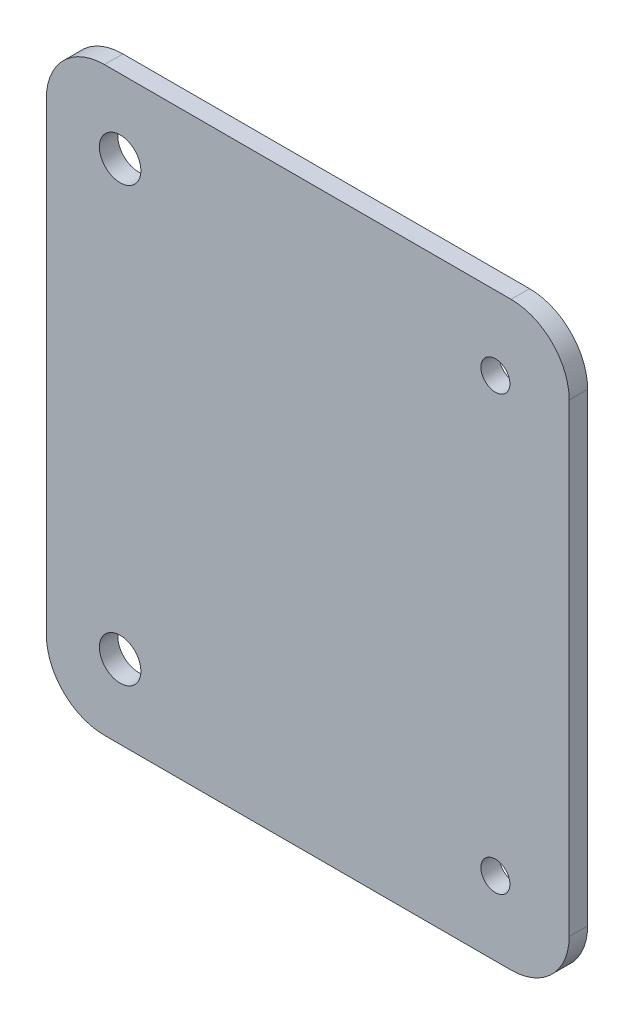
ISO-10303-21;
HEADER;
FILE_DESCRIPTION(('STEP AP214'),'2;1');
FILE_NAME('part.step','',(''),(''),'','','');
FILE_SCHEMA(('AUTOMOTIVE_DESIGN { 1 0 10303 214 1 1 1 1 }'));
ENDSEC;
DATA;
#1=APPLICATION_CONTEXT('core data for automotive mechanical design processes');
#2=APPLICATION_PROTOCOL_DEFINITION('international standard','automotive_design',2000,#1);
#3=PRODUCT_CONTEXT('',#1,'mechanical');
#4=PRODUCT('Part','Part','',(#3));
#5=PRODUCT_RELATED_PRODUCT_CATEGORY('part','',(#4));
#6=PRODUCT_DEFINITION_FORMATION('','',#4);
#7=PRODUCT_DEFINITION_CONTEXT('part definition',#1,'design');
#8=PRODUCT_DEFINITION('design','',#6,#7);
#9=PRODUCT_DEFINITION_SHAPE('','',#8);
#10=(LENGTH_UNIT() NAMED_UNIT(*) SI_UNIT(.MILLI.,.METRE.));
#11=(NAMED_UNIT(*) PLANE_ANGLE_UNIT() SI_UNIT($,.RADIAN.));
#12=(NAMED_UNIT(*) SI_UNIT($,.STERADIAN.) SOLID_ANGLE_UNIT());
#13=UNCERTAINTY_MEASURE_WITH_UNIT(LENGTH_MEASURE(1.E-05),#10,'distance_accuracy_value','');
#14=(GEOMETRIC_REPRESENTATION_CONTEXT(3) GLOBAL_UNCERTAINTY_ASSIGNED_CONTEXT((#13)) GLOBAL_UNIT_ASSIGNED_CONTEXT((#10,
#11,#12)) REPRESENTATION_CONTEXT('',''));
#15=CARTESIAN_POINT('',(0.,0.,0.));
#16=DIRECTION('',(0.,0.,1.));
#17=DIRECTION('',(1.,0.,0.));
#18=AXIS2_PLACEMENT_3D('',#15,#16,#17);
#19=CARTESIAN_POINT('',(-45.,-55.,15.5498128920983));
#20=DIRECTION('',(-1.,0.,0.));
#21=DIRECTION('',(0.,0.,1.));
#22=AXIS2_PLACEMENT_3D('',#19,#20,#21);
#23=PLANE('',#22);
#24=DIRECTION('',(0.,-1.,0.));
#25=VECTOR('',#24,1.);
#26=CARTESIAN_POINT('',(-45.,-55.,18.7298128920983));
#27=LINE('',#26,#25);
#28=CARTESIAN_POINT('',(-45.,35.,18.7298128920983));
#29=VERTEX_POINT('',#28);
#30=CARTESIAN_POINT('',(-45.,-45.,18.7298128920983));
#31=VERTEX_POINT('',#30);
#32=EDGE_CURVE('E103',#29,#31,#27,.T.);
#33=ORIENTED_EDGE('',*,*,#32,.F.);
#34=DIRECTION('',(0.,0.,1.));
#35=VECTOR('',#34,1.);
#36=CARTESIAN_POINT('',(-45.,35.,15.5498128920983));
#37=LINE('',#36,#35);
#38=CARTESIAN_POINT('',(-45.,35.,15.5498128920983));
#39=VERTEX_POINT('',#38);
#40=EDGE_CURVE('E11',#29,#39,#37,.F.);
#41=ORIENTED_EDGE('',*,*,#40,.T.);
#42=DIRECTION('',(0.,-1.,0.));
#43=VECTOR('',#42,1.);
#44=CARTESIAN_POINT('',(-45.,-55.,15.5498128920983));
#45=LINE('',#44,#43);
#46=CARTESIAN_POINT('',(-45.,-45.,15.5498128920983));
#47=VERTEX_POINT('',#46);
#48=EDGE_CURVE('E153',#39,#47,#45,.T.);
#49=ORIENTED_EDGE('',*,*,#48,.T.);
#50=DIRECTION('',(0.,0.,1.));
#51=VECTOR('',#50,1.);
#52=CARTESIAN_POINT('',(-45.,-45.,15.5498128920983));
#53=LINE('',#52,#51);
#54=EDGE_CURVE('E40',#47,#31,#53,.T.);
#55=ORIENTED_EDGE('',*,*,#54,.T.);
#56=EDGE_LOOP('',(#33,#41,#49,#55));
#57=FACE_BOUND('',#56,.T.);
#58=ADVANCED_FACE('F32',(#57),#23,.T.);
#59=CARTESIAN_POINT('',(-45.,45.,15.5498128920983));
#60=DIRECTION('',(0.,1.,0.));
#61=DIRECTION('',(0.,0.,1.));
#62=AXIS2_PLACEMENT_3D('',#59,#60,#61);
#63=PLANE('',#62);
#64=DIRECTION('',(-1.,0.,0.));
#65=VECTOR('',#64,1.);
#66=CARTESIAN_POINT('',(-45.,45.,18.7298128920983));
#67=LINE('',#66,#65);
#68=CARTESIAN_POINT('',(35.,45.,18.7298128920983));
#69=VERTEX_POINT('',#68);
#70=CARTESIAN_POINT('',(-35.,45.,18.7298128920983));
#71=VERTEX_POINT('',#70);
#72=EDGE_CURVE('E128',#69,#71,#67,.T.);
#73=ORIENTED_EDGE('',*,*,#72,.F.);
#74=DIRECTION('',(0.,0.,1.));
#75=VECTOR('',#74,1.);
#76=CARTESIAN_POINT('',(35.,45.,15.5498128920983));
#77=LINE('',#76,#75);
#78=CARTESIAN_POINT('',(35.,45.,15.5498128920983));
#79=VERTEX_POINT('',#78);
#80=EDGE_CURVE('E54',#69,#79,#77,.F.);
#81=ORIENTED_EDGE('',*,*,#80,.T.);
#82=DIRECTION('',(-1.,0.,0.));
#83=VECTOR('',#82,1.);
#84=CARTESIAN_POINT('',(-45.,45.,15.5498128920983));
#85=LINE('',#84,#83);
#86=CARTESIAN_POINT('',(-35.,45.,15.5498128920983));
#87=VERTEX_POINT('',#86);
#88=EDGE_CURVE('E122',#79,#87,#85,.T.);
#89=ORIENTED_EDGE('',*,*,#88,.T.);
#90=DIRECTION('',(0.,0.,1.));
#91=VECTOR('',#90,1.);
#92=CARTESIAN_POINT('',(-35.,45.,15.5498128920983));
#93=LINE('',#92,#91);
#94=EDGE_CURVE('E147',#87,#71,#93,.T.);
#95=ORIENTED_EDGE('',*,*,#94,.T.);
#96=EDGE_LOOP('',(#73,#81,#89,#95));
#97=FACE_BOUND('',#96,.T.);
#98=ADVANCED_FACE('F190',(#97),#63,.T.);
#99=CARTESIAN_POINT('',(45.,-55.,15.5498128920983));
#100=DIRECTION('',(1.,0.,0.));
#101=DIRECTION('',(0.,0.,-1.));
#102=AXIS2_PLACEMENT_3D('',#99,#100,#101);
#103=PLANE('',#102);
#104=DIRECTION('',(0.,1.,0.));
#105=VECTOR('',#104,1.);
#106=CARTESIAN_POINT('',(45.,-55.,18.7298128920983));
#107=LINE('',#106,#105);
#108=CARTESIAN_POINT('',(45.,-45.,18.7298128920983));
#109=VERTEX_POINT('',#108);
#110=CARTESIAN_POINT('',(45.,35.,18.7298128920983));
#111=VERTEX_POINT('',#110);
#112=EDGE_CURVE('E118',#109,#111,#107,.T.);
#113=ORIENTED_EDGE('',*,*,#112,.F.);
#114=DIRECTION('',(0.,0.,1.));
#115=VECTOR('',#114,1.);
#116=CARTESIAN_POINT('',(45.,-45.,15.5498128920983));
#117=LINE('',#116,#115);
#118=CARTESIAN_POINT('',(45.,-45.,15.5498128920983));
#119=VERTEX_POINT('',#118);
#120=EDGE_CURVE('E139',#109,#119,#117,.F.);
#121=ORIENTED_EDGE('',*,*,#120,.T.);
#122=DIRECTION('',(0.,1.,0.));
#123=VECTOR('',#122,1.);
#124=CARTESIAN_POINT('',(45.,-55.,15.5498128920983));
#125=LINE('',#124,#123);
#126=CARTESIAN_POINT('',(45.,35.,15.5498128920983));
#127=VERTEX_POINT('',#126);
#128=EDGE_CURVE('E125',#119,#127,#125,.T.);
#129=ORIENTED_EDGE('',*,*,#128,.T.);
#130=DIRECTION('',(0.,0.,1.));
#131=VECTOR('',#130,1.);
#132=CARTESIAN_POINT('',(45.,35.,15.5498128920983));
#133=LINE('',#132,#131);
#134=EDGE_CURVE('E136',#127,#111,#133,.T.);
#135=ORIENTED_EDGE('',*,*,#134,.T.);
#136=EDGE_LOOP('',(#113,#121,#129,#135));
#137=FACE_BOUND('',#136,.T.);
#138=ADVANCED_FACE('F169',(#137),#103,.T.);
#139=CARTESIAN_POINT('',(-45.,-55.,15.5498128920983));
#140=DIRECTION('',(0.,-1.,0.));
#141=DIRECTION('',(0.,0.,-1.));
#142=AXIS2_PLACEMENT_3D('',#139,#140,#141);
#143=PLANE('',#142);
#144=DIRECTION('',(1.,0.,0.));
#145=VECTOR('',#144,1.);
#146=CARTESIAN_POINT('',(-45.,-55.,15.5498128920983));
#147=LINE('',#146,#145);
#148=CARTESIAN_POINT('',(-35.,-55.,15.5498128920983));
#149=VERTEX_POINT('',#148);
#150=CARTESIAN_POINT('',(35.,-55.,15.5498128920983));
#151=VERTEX_POINT('',#150);
#152=EDGE_CURVE('E154',#149,#151,#147,.T.);
#153=ORIENTED_EDGE('',*,*,#152,.T.);
#154=DIRECTION('',(0.,0.,1.));
#155=VECTOR('',#154,1.);
#156=CARTESIAN_POINT('',(35.,-55.,15.5498128920983));
#157=LINE('',#156,#155);
#158=CARTESIAN_POINT('',(35.,-55.,18.7298128920983));
#159=VERTEX_POINT('',#158);
#160=EDGE_CURVE('E109',#151,#159,#157,.T.);
#161=ORIENTED_EDGE('',*,*,#160,.T.);
#162=DIRECTION('',(1.,0.,0.));
#163=VECTOR('',#162,1.);
#164=CARTESIAN_POINT('',(-45.,-55.,18.7298128920983));
#165=LINE('',#164,#163);
#166=CARTESIAN_POINT('',(-35.,-55.,18.7298128920983));
#167=VERTEX_POINT('',#166);
#168=EDGE_CURVE('E101',#167,#159,#165,.T.);
#169=ORIENTED_EDGE('',*,*,#168,.F.);
#170=DIRECTION('',(0.,0.,1.));
#171=VECTOR('',#170,1.);
#172=CARTESIAN_POINT('',(-35.,-55.,15.5498128920983));
#173=LINE('',#172,#171);
#174=EDGE_CURVE('E115',#167,#149,#173,.F.);
#175=ORIENTED_EDGE('',*,*,#174,.T.);
#176=EDGE_LOOP('',(#153,#161,#169,#175));
#177=FACE_BOUND('',#176,.T.);
#178=ADVANCED_FACE('F114',(#177),#143,.T.);
#179=CARTESIAN_POINT('',(0.,0.,15.5498128920983));
#180=DIRECTION('',(0.,0.,-1.));
#181=DIRECTION('',(-1.,0.,0.));
#182=AXIS2_PLACEMENT_3D('',#179,#180,#181);
#183=PLANE('',#182);
#184=CARTESIAN_POINT('',(32.3,32.3000000000001,15.5498128920983));
#185=DIRECTION('',(0.,0.,1.));
#186=DIRECTION('',(1.,0.,0.));
#187=AXIS2_PLACEMENT_3D('',#184,#185,#186);
#188=CIRCLE('',#187,2.5);
#189=CARTESIAN_POINT('',(34.8,32.3000000000001,15.5498128920983));
#190=VERTEX_POINT('',#189);
#191=EDGE_CURVE('E226',#190,#190,#188,.T.);
#192=ORIENTED_EDGE('',*,*,#191,.T.);
#193=EDGE_LOOP('',(#192));
#194=FACE_BOUND('',#193,.T.);
#195=CARTESIAN_POINT('',(-32.3,32.3,15.5498128920983));
#196=DIRECTION('',(0.,0.,1.));
#197=DIRECTION('',(1.,0.,0.));
#198=AXIS2_PLACEMENT_3D('',#195,#196,#197);
#199=CIRCLE('',#198,3.57);
#200=CARTESIAN_POINT('',(-28.73,32.3,15.5498128920983));
#201=VERTEX_POINT('',#200);
#202=EDGE_CURVE('E234',#201,#201,#199,.T.);
#203=ORIENTED_EDGE('',*,*,#202,.T.);
#204=EDGE_LOOP('',(#203));
#205=FACE_BOUND('',#204,.T.);
#206=CARTESIAN_POINT('',(-32.3,-42.3,15.5498128920983));
#207=DIRECTION('',(0.,0.,1.));
#208=DIRECTION('',(1.,0.,0.));
#209=AXIS2_PLACEMENT_3D('',#206,#207,#208);
#210=CIRCLE('',#209,3.57);
#211=CARTESIAN_POINT('',(-28.73,-42.3,15.5498128920983));
#212=VERTEX_POINT('',#211);
#213=EDGE_CURVE('E240',#212,#212,#210,.T.);
#214=ORIENTED_EDGE('',*,*,#213,.T.);
#215=EDGE_LOOP('',(#214));
#216=FACE_BOUND('',#215,.T.);
#217=CARTESIAN_POINT('',(32.3,-42.3,15.5498128920983));
#218=DIRECTION('',(0.,0.,1.));
#219=DIRECTION('',(1.,0.,0.));
#220=AXIS2_PLACEMENT_3D('',#217,#218,#219);
#221=CIRCLE('',#220,2.5);
#222=CARTESIAN_POINT('',(34.8,-42.3,15.5498128920983));
#223=VERTEX_POINT('',#222);
#224=EDGE_CURVE('E164',#223,#223,#221,.T.);
#225=ORIENTED_EDGE('',*,*,#224,.T.);
#226=EDGE_LOOP('',(#225));
#227=FACE_BOUND('',#226,.T.);
#228=ORIENTED_EDGE('',*,*,#128,.F.);
#229=CARTESIAN_POINT('',(35.,-45.,15.5498128920983));
#230=DIRECTION('',(0.,0.,-1.));
#231=DIRECTION('',(-1.,0.,0.));
#232=AXIS2_PLACEMENT_3D('',#229,#230,#231);
#233=CIRCLE('',#232,10.);
#234=EDGE_CURVE('E145',#119,#151,#233,.T.);
#235=ORIENTED_EDGE('',*,*,#234,.T.);
#236=ORIENTED_EDGE('',*,*,#152,.F.);
#237=CARTESIAN_POINT('',(-35.,-45.,15.5498128920983));
#238=DIRECTION('',(0.,0.,-1.));
#239=DIRECTION('',(-1.,0.,0.));
#240=AXIS2_PLACEMENT_3D('',#237,#238,#239);
#241=CIRCLE('',#240,10.);
#242=EDGE_CURVE('E121',#149,#47,#241,.T.);
#243=ORIENTED_EDGE('',*,*,#242,.T.);
#244=ORIENTED_EDGE('',*,*,#48,.F.);
#245=CARTESIAN_POINT('',(-35.,35.,15.5498128920983));
#246=DIRECTION('',(0.,0.,-1.));
#247=DIRECTION('',(-1.,0.,0.));
#248=AXIS2_PLACEMENT_3D('',#245,#246,#247);
#249=CIRCLE('',#248,10.);
#250=EDGE_CURVE('E47',#39,#87,#249,.T.);
#251=ORIENTED_EDGE('',*,*,#250,.T.);
#252=ORIENTED_EDGE('',*,*,#88,.F.);
#253=CARTESIAN_POINT('',(35.,35.,15.5498128920983));
#254=DIRECTION('',(0.,0.,-1.));
#255=DIRECTION('',(-1.,0.,0.));
#256=AXIS2_PLACEMENT_3D('',#253,#254,#255);
#257=CIRCLE('',#256,10.);
#258=EDGE_CURVE('E143',#79,#127,#257,.T.);
#259=ORIENTED_EDGE('',*,*,#258,.T.);
#260=EDGE_LOOP('',(#228,#235,#236,#243,#244,#251,#252,#259));
#261=FACE_BOUND('',#260,.T.);
#262=ADVANCED_FACE('F175',(#194,#205,#216,#227,#261),#183,.T.);
#263=CARTESIAN_POINT('',(0.,0.,18.7298128920983));
#264=DIRECTION('',(0.,0.,-1.));
#265=DIRECTION('',(-1.,0.,0.));
#266=AXIS2_PLACEMENT_3D('',#263,#264,#265);
#267=PLANE('',#266);
#268=CARTESIAN_POINT('',(32.3,32.3000000000001,18.7298128920983));
#269=DIRECTION('',(0.,0.,1.));
#270=DIRECTION('',(1.,0.,0.));
#271=AXIS2_PLACEMENT_3D('',#268,#269,#270);
#272=CIRCLE('',#271,2.5);
#273=CARTESIAN_POINT('',(34.8,32.3000000000001,18.7298128920983));
#274=VERTEX_POINT('',#273);
#275=EDGE_CURVE('E229',#274,#274,#272,.T.);
#276=ORIENTED_EDGE('',*,*,#275,.F.);
#277=EDGE_LOOP('',(#276));
#278=FACE_BOUND('',#277,.T.);
#279=CARTESIAN_POINT('',(-32.3,32.3,18.7298128920983));
#280=DIRECTION('',(0.,0.,1.));
#281=DIRECTION('',(1.,0.,0.));
#282=AXIS2_PLACEMENT_3D('',#279,#280,#281);
#283=CIRCLE('',#282,3.57);
#284=CARTESIAN_POINT('',(-28.73,32.3,18.7298128920983));
#285=VERTEX_POINT('',#284);
#286=EDGE_CURVE('E231',#285,#285,#283,.T.);
#287=ORIENTED_EDGE('',*,*,#286,.F.);
#288=EDGE_LOOP('',(#287));
#289=FACE_BOUND('',#288,.T.);
#290=CARTESIAN_POINT('',(-32.3,-42.3,18.7298128920983));
#291=DIRECTION('',(0.,0.,1.));
#292=DIRECTION('',(1.,0.,0.));
#293=AXIS2_PLACEMENT_3D('',#290,#291,#292);
#294=CIRCLE('',#293,3.57);
#295=CARTESIAN_POINT('',(-28.73,-42.3,18.7298128920983));
#296=VERTEX_POINT('',#295);
#297=EDGE_CURVE('E237',#296,#296,#294,.T.);
#298=ORIENTED_EDGE('',*,*,#297,.F.);
#299=EDGE_LOOP('',(#298));
#300=FACE_BOUND('',#299,.T.);
#301=CARTESIAN_POINT('',(32.3,-42.3,18.7298128920983));
#302=DIRECTION('',(0.,0.,1.));
#303=DIRECTION('',(1.,0.,0.));
#304=AXIS2_PLACEMENT_3D('',#301,#302,#303);
#305=CIRCLE('',#304,2.5);
#306=CARTESIAN_POINT('',(34.8,-42.3,18.7298128920983));
#307=VERTEX_POINT('',#306);
#308=EDGE_CURVE('E159',#307,#307,#305,.T.);
#309=ORIENTED_EDGE('',*,*,#308,.F.);
#310=EDGE_LOOP('',(#309));
#311=FACE_BOUND('',#310,.T.);
#312=ORIENTED_EDGE('',*,*,#168,.T.);
#313=CARTESIAN_POINT('',(35.,-45.,18.7298128920983));
#314=DIRECTION('',(0.,0.,-1.));
#315=DIRECTION('',(-1.,0.,0.));
#316=AXIS2_PLACEMENT_3D('',#313,#314,#315);
#317=CIRCLE('',#316,10.);
#318=EDGE_CURVE('E134',#159,#109,#317,.F.);
#319=ORIENTED_EDGE('',*,*,#318,.T.);
#320=ORIENTED_EDGE('',*,*,#112,.T.);
#321=CARTESIAN_POINT('',(35.,35.,18.7298128920983));
#322=DIRECTION('',(0.,0.,-1.));
#323=DIRECTION('',(-1.,0.,0.));
#324=AXIS2_PLACEMENT_3D('',#321,#322,#323);
#325=CIRCLE('',#324,10.);
#326=EDGE_CURVE('E132',#111,#69,#325,.F.);
#327=ORIENTED_EDGE('',*,*,#326,.T.);
#328=ORIENTED_EDGE('',*,*,#72,.T.);
#329=CARTESIAN_POINT('',(-35.,35.,18.7298128920983));
#330=DIRECTION('',(0.,0.,-1.));
#331=DIRECTION('',(-1.,0.,0.));
#332=AXIS2_PLACEMENT_3D('',#329,#330,#331);
#333=CIRCLE('',#332,10.);
#334=EDGE_CURVE('E108',#71,#29,#333,.F.);
#335=ORIENTED_EDGE('',*,*,#334,.T.);
#336=ORIENTED_EDGE('',*,*,#32,.T.);
#337=CARTESIAN_POINT('',(-35.,-45.,18.7298128920983));
#338=DIRECTION('',(0.,0.,-1.));
#339=DIRECTION('',(-1.,0.,0.));
#340=AXIS2_PLACEMENT_3D('',#337,#338,#339);
#341=CIRCLE('',#340,10.);
#342=EDGE_CURVE('E98',#31,#167,#341,.F.);
#343=ORIENTED_EDGE('',*,*,#342,.T.);
#344=EDGE_LOOP('',(#312,#319,#320,#327,#328,#335,#336,#343));
#345=FACE_BOUND('',#344,.T.);
#346=ADVANCED_FACE('F100',(#278,#289,#300,#311,#345),#267,.F.);
#347=CARTESIAN_POINT('',(32.3,-42.3,15.5498128920983));
#348=DIRECTION('',(0.,0.,1.));
#349=DIRECTION('',(1.,0.,0.));
#350=AXIS2_PLACEMENT_3D('',#347,#348,#349);
#351=CYLINDRICAL_SURFACE('',#350,2.5);
#352=CARTESIAN_POINT('',(34.8,-42.3,15.5498128920983));
#353=CARTESIAN_POINT('',(34.8,-42.3,15.5829378920983));
#354=CARTESIAN_POINT('',(34.8,-42.3,15.6160628920983));
#355=CARTESIAN_POINT('',(34.8,-42.3,15.6823128920983));
#356=CARTESIAN_POINT('',(34.8,-42.3,15.7154378920983));
#357=CARTESIAN_POINT('',(34.8,-42.3,15.7816878920983));
#358=CARTESIAN_POINT('',(34.8,-42.3,15.8148128920983));
#359=CARTESIAN_POINT('',(34.8,-42.3,15.8810628920983));
#360=CARTESIAN_POINT('',(34.8,-42.3,15.9141878920983));
#361=CARTESIAN_POINT('',(34.8,-42.3,15.9804378920983));
#362=CARTESIAN_POINT('',(34.8,-42.3,16.0135628920983));
#363=CARTESIAN_POINT('',(34.8,-42.3,16.0798128920983));
#364=CARTESIAN_POINT('',(34.8,-42.3,16.1129378920983));
#365=CARTESIAN_POINT('',(34.8,-42.3,16.1791878920983));
#366=CARTESIAN_POINT('',(34.8,-42.3,16.2123128920983));
#367=CARTESIAN_POINT('',(34.8,-42.3,16.2785628920983));
#368=CARTESIAN_POINT('',(34.8,-42.3,16.3116878920983));
#369=CARTESIAN_POINT('',(34.8,-42.3,16.3779378920983));
#370=CARTESIAN_POINT('',(34.8,-42.3,16.4110628920983));
#371=CARTESIAN_POINT('',(34.8,-42.3,16.4773128920983));
#372=CARTESIAN_POINT('',(34.8,-42.3,16.5104378920983));
#373=CARTESIAN_POINT('',(34.8,-42.3,16.5766878920983));
#374=CARTESIAN_POINT('',(34.8,-42.3,16.6098128920983));
#375=CARTESIAN_POINT('',(34.8,-42.3,16.6760628920983));
#376=CARTESIAN_POINT('',(34.8,-42.3,16.7091878920983));
#377=CARTESIAN_POINT('',(34.8,-42.3,16.7754378920983));
#378=CARTESIAN_POINT('',(34.8,-42.3,16.8085628920983));
#379=CARTESIAN_POINT('',(34.8,-42.3,16.8748128920983));
#380=CARTESIAN_POINT('',(34.8,-42.3,16.9079378920983));
#381=CARTESIAN_POINT('',(34.8,-42.3,16.9741878920983));
#382=CARTESIAN_POINT('',(34.8,-42.3,17.0073128920983));
#383=CARTESIAN_POINT('',(34.8,-42.3,17.0735628920983));
#384=CARTESIAN_POINT('',(34.8,-42.3,17.1066878920983));
#385=CARTESIAN_POINT('',(34.8,-42.3,17.1729378920983));
#386=CARTESIAN_POINT('',(34.8,-42.3,17.2060628920983));
#387=CARTESIAN_POINT('',(34.8,-42.3,17.2723128920983));
#388=CARTESIAN_POINT('',(34.8,-42.3,17.3054378920983));
#389=CARTESIAN_POINT('',(34.8,-42.3,17.3716878920983));
#390=CARTESIAN_POINT('',(34.8,-42.3,17.4048128920983));
#391=CARTESIAN_POINT('',(34.8,-42.3,17.4710628920983));
#392=CARTESIAN_POINT('',(34.8,-42.3,17.5041878920983));
#393=CARTESIAN_POINT('',(34.8,-42.3,17.5704378920983));
#394=CARTESIAN_POINT('',(34.8,-42.3,17.6035628920983));
#395=CARTESIAN_POINT('',(34.8,-42.3,17.6698128920983));
#396=CARTESIAN_POINT('',(34.8,-42.3,17.7029378920983));
#397=CARTESIAN_POINT('',(34.8,-42.3,17.7691878920983));
#398=CARTESIAN_POINT('',(34.8,-42.3,17.8023128920983));
#399=CARTESIAN_POINT('',(34.8,-42.3,17.8685628920983));
#400=CARTESIAN_POINT('',(34.8,-42.3,17.9016878920983));
#401=CARTESIAN_POINT('',(34.8,-42.3,17.9679378920983));
#402=CARTESIAN_POINT('',(34.8,-42.3,18.0010628920983));
#403=CARTESIAN_POINT('',(34.8,-42.3,18.0673128920983));
#404=CARTESIAN_POINT('',(34.8,-42.3,18.1004378920983));
#405=CARTESIAN_POINT('',(34.8,-42.3,18.1666878920983));
#406=CARTESIAN_POINT('',(34.8,-42.3,18.1998128920983));
#407=CARTESIAN_POINT('',(34.8,-42.3,18.2660628920983));
#408=CARTESIAN_POINT('',(34.8,-42.3,18.2991878920983));
#409=CARTESIAN_POINT('',(34.8,-42.3,18.3654378920983));
#410=CARTESIAN_POINT('',(34.8,-42.3,18.3985628920983));
#411=CARTESIAN_POINT('',(34.8,-42.3,18.4648128920983));
#412=CARTESIAN_POINT('',(34.8,-42.3,18.4979378920983));
#413=CARTESIAN_POINT('',(34.8,-42.3,18.5641878920983));
#414=CARTESIAN_POINT('',(34.8,-42.3,18.5973128920983));
#415=CARTESIAN_POINT('',(34.8,-42.3,18.6635628920983));
#416=CARTESIAN_POINT('',(34.8,-42.3,18.6966878920983));
#417=CARTESIAN_POINT('',(34.8,-42.3,18.7298128920983));
#418=B_SPLINE_CURVE_WITH_KNOTS('',3,(#352,#353,#354,#355,#356,#357,#358,#359,#360,#361,#362,
#363,#364,#365,#366,#367,#368,#369,#370,#371,#372,#373,#374,#375,#376,#377,#378,#379,#380,#381,
#382,#383,#384,#385,#386,#387,#388,#389,#390,#391,#392,#393,#394,#395,#396,#397,#398,#399,#400,
#401,#402,#403,#404,#405,#406,#407,#408,#409,#410,#411,#412,#413,#414,#415,#416,#417),
.UNSPECIFIED.,.F.,.F.,(4,2,2,2,2,2,2,2,2,2,2,2,2,2,2,2,2,2,2,2,2,2,2,2,2,2,2,2,2,2,2,2,4),(0.,
0.0993750000000005,0.198749999999999,0.298124999999998,0.3975,0.496874999999999,
0.596249999999998,0.695625,0.794999999999999,0.894374999999998,0.99375,1.093125,1.1925,1.291875,
1.39125,1.490625,1.59,1.689375,1.78875,1.888125,1.9875,2.086875,2.18625,2.285625,2.385,2.484375,
2.58375,2.683125,2.7825,2.881875,2.98125,3.080625,3.18),.UNSPECIFIED.);
#419=EDGE_CURVE('BSEAM203',#223,#307,#418,.T.);
#420=ORIENTED_EDGE('',*,*,#224,.F.);
#421=ORIENTED_EDGE('',*,*,#308,.T.);
#422=ORIENTED_EDGE('',*,*,#419,.T.);
#423=ORIENTED_EDGE('',*,*,#419,.F.);
#424=EDGE_LOOP('',(#420,#422,#421,#423));
#425=FACE_BOUND('',#424,.T.);
#426=ADVANCED_FACE('F203',(#425),#351,.F.);
#427=CARTESIAN_POINT('',(-32.3,-42.3,15.5498128920983));
#428=DIRECTION('',(0.,0.,1.));
#429=DIRECTION('',(1.,0.,0.));
#430=AXIS2_PLACEMENT_3D('',#427,#428,#429);
#431=CYLINDRICAL_SURFACE('',#430,3.57);
#432=CARTESIAN_POINT('',(-28.73,-42.3,15.5498128920983));
#433=CARTESIAN_POINT('',(-28.73,-42.3,15.5829378920983));
#434=CARTESIAN_POINT('',(-28.73,-42.3,15.6160628920983));
#435=CARTESIAN_POINT('',(-28.73,-42.3,15.6823128920983));
#436=CARTESIAN_POINT('',(-28.73,-42.3,15.7154378920983));
#437=CARTESIAN_POINT('',(-28.73,-42.3,15.7816878920983));
#438=CARTESIAN_POINT('',(-28.73,-42.3,15.8148128920983));
#439=CARTESIAN_POINT('',(-28.73,-42.3,15.8810628920983));
#440=CARTESIAN_POINT('',(-28.73,-42.3,15.9141878920983));
#441=CARTESIAN_POINT('',(-28.73,-42.3,15.9804378920983));
#442=CARTESIAN_POINT('',(-28.73,-42.3,16.0135628920983));
#443=CARTESIAN_POINT('',(-28.73,-42.3,16.0798128920983));
#444=CARTESIAN_POINT('',(-28.73,-42.3,16.1129378920983));
#445=CARTESIAN_POINT('',(-28.73,-42.3,16.1791878920983));
#446=CARTESIAN_POINT('',(-28.73,-42.3,16.2123128920983));
#447=CARTESIAN_POINT('',(-28.73,-42.3,16.2785628920983));
#448=CARTESIAN_POINT('',(-28.73,-42.3,16.3116878920983));
#449=CARTESIAN_POINT('',(-28.73,-42.3,16.3779378920983));
#450=CARTESIAN_POINT('',(-28.73,-42.3,16.4110628920983));
#451=CARTESIAN_POINT('',(-28.73,-42.3,16.4773128920983));
#452=CARTESIAN_POINT('',(-28.73,-42.3,16.5104378920983));
#453=CARTESIAN_POINT('',(-28.73,-42.3,16.5766878920983));
#454=CARTESIAN_POINT('',(-28.73,-42.3,16.6098128920983));
#455=CARTESIAN_POINT('',(-28.73,-42.3,16.6760628920983));
#456=CARTESIAN_POINT('',(-28.73,-42.3,16.7091878920983));
#457=CARTESIAN_POINT('',(-28.73,-42.3,16.7754378920983));
#458=CARTESIAN_POINT('',(-28.73,-42.3,16.8085628920983));
#459=CARTESIAN_POINT('',(-28.73,-42.3,16.8748128920983));
#460=CARTESIAN_POINT('',(-28.73,-42.3,16.9079378920983));
#461=CARTESIAN_POINT('',(-28.73,-42.3,16.9741878920983));
#462=CARTESIAN_POINT('',(-28.73,-42.3,17.0073128920983));
#463=CARTESIAN_POINT('',(-28.73,-42.3,17.0735628920983));
#464=CARTESIAN_POINT('',(-28.73,-42.3,17.1066878920983));
#465=CARTESIAN_POINT('',(-28.73,-42.3,17.1729378920983));
#466=CARTESIAN_POINT('',(-28.73,-42.3,17.2060628920983));
#467=CARTESIAN_POINT('',(-28.73,-42.3,17.2723128920983));
#468=CARTESIAN_POINT('',(-28.73,-42.3,17.3054378920983));
#469=CARTESIAN_POINT('',(-28.73,-42.3,17.3716878920983));
#470=CARTESIAN_POINT('',(-28.73,-42.3,17.4048128920983));
#471=CARTESIAN_POINT('',(-28.73,-42.3,17.4710628920983));
#472=CARTESIAN_POINT('',(-28.73,-42.3,17.5041878920983));
#473=CARTESIAN_POINT('',(-28.73,-42.3,17.5704378920983));
#474=CARTESIAN_POINT('',(-28.73,-42.3,17.6035628920983));
#475=CARTESIAN_POINT('',(-28.73,-42.3,17.6698128920983));
#476=CARTESIAN_POINT('',(-28.73,-42.3,17.7029378920983));
#477=CARTESIAN_POINT('',(-28.73,-42.3,17.7691878920983));
#478=CARTESIAN_POINT('',(-28.73,-42.3,17.8023128920983));
#479=CARTESIAN_POINT('',(-28.73,-42.3,17.8685628920983));
#480=CARTESIAN_POINT('',(-28.73,-42.3,17.9016878920983));
#481=CARTESIAN_POINT('',(-28.73,-42.3,17.9679378920983));
#482=CARTESIAN_POINT('',(-28.73,-42.3,18.0010628920983));
#483=CARTESIAN_POINT('',(-28.73,-42.3,18.0673128920983));
#484=CARTESIAN_POINT('',(-28.73,-42.3,18.1004378920983));
#485=CARTESIAN_POINT('',(-28.73,-42.3,18.1666878920983));
#486=CARTESIAN_POINT('',(-28.73,-42.3,18.1998128920983));
#487=CARTESIAN_POINT('',(-28.73,-42.3,18.2660628920983));
#488=CARTESIAN_POINT('',(-28.73,-42.3,18.2991878920983));
#489=CARTESIAN_POINT('',(-28.73,-42.3,18.3654378920983));
#490=CARTESIAN_POINT('',(-28.73,-42.3,18.3985628920983));
#491=CARTESIAN_POINT('',(-28.73,-42.3,18.4648128920983));
#492=CARTESIAN_POINT('',(-28.73,-42.3,18.4979378920983));
#493=CARTESIAN_POINT('',(-28.73,-42.3,18.5641878920983));
#494=CARTESIAN_POINT('',(-28.73,-42.3,18.5973128920983));
#495=CARTESIAN_POINT('',(-28.73,-42.3,18.6635628920983));
#496=CARTESIAN_POINT('',(-28.73,-42.3,18.6966878920983));
#497=CARTESIAN_POINT('',(-28.73,-42.3,18.7298128920983));
#498=B_SPLINE_CURVE_WITH_KNOTS('',3,(#432,#433,#434,#435,#436,#437,#438,#439,#440,#441,#442,
#443,#444,#445,#446,#447,#448,#449,#450,#451,#452,#453,#454,#455,#456,#457,#458,#459,#460,#461,
#462,#463,#464,#465,#466,#467,#468,#469,#470,#471,#472,#473,#474,#475,#476,#477,#478,#479,#480,
#481,#482,#483,#484,#485,#486,#487,#488,#489,#490,#491,#492,#493,#494,#495,#496,#497),
.UNSPECIFIED.,.F.,.F.,(4,2,2,2,2,2,2,2,2,2,2,2,2,2,2,2,2,2,2,2,2,2,2,2,2,2,2,2,2,2,2,2,4),(0.,
0.0993750000000022,0.198750000000001,0.298125,0.397500000000002,0.496875000000001,0.59625,
0.695625000000002,0.795000000000001,0.894374999999999,0.993750000000002,1.093125,1.1925,
1.291875,1.39125,1.490625,1.59,1.689375,1.78875,1.888125,1.9875,2.086875,2.18625,2.285625,2.385,
2.484375,2.58375,2.683125,2.7825,2.881875,2.98125,3.080625,3.18),.UNSPECIFIED.);
#499=EDGE_CURVE('BSEAM210',#212,#296,#498,.T.);
#500=ORIENTED_EDGE('',*,*,#213,.F.);
#501=ORIENTED_EDGE('',*,*,#297,.T.);
#502=ORIENTED_EDGE('',*,*,#499,.T.);
#503=ORIENTED_EDGE('',*,*,#499,.F.);
#504=EDGE_LOOP('',(#500,#502,#501,#503));
#505=FACE_BOUND('',#504,.T.);
#506=ADVANCED_FACE('F210',(#505),#431,.F.);
#507=CARTESIAN_POINT('',(-32.3,32.3,15.5498128920983));
#508=DIRECTION('',(0.,0.,1.));
#509=DIRECTION('',(1.,0.,0.));
#510=AXIS2_PLACEMENT_3D('',#507,#508,#509);
#511=CYLINDRICAL_SURFACE('',#510,3.57);
#512=CARTESIAN_POINT('',(-28.73,32.3,15.5498128920983));
#513=CARTESIAN_POINT('',(-28.73,32.3,15.5829378920983));
#514=CARTESIAN_POINT('',(-28.73,32.3,15.6160628920983));
#515=CARTESIAN_POINT('',(-28.73,32.3,15.6823128920983));
#516=CARTESIAN_POINT('',(-28.73,32.3,15.7154378920983));
#517=CARTESIAN_POINT('',(-28.73,32.3,15.7816878920983));
#518=CARTESIAN_POINT('',(-28.73,32.3,15.8148128920983));
#519=CARTESIAN_POINT('',(-28.73,32.3,15.8810628920983));
#520=CARTESIAN_POINT('',(-28.73,32.3,15.9141878920983));
#521=CARTESIAN_POINT('',(-28.73,32.3,15.9804378920983));
#522=CARTESIAN_POINT('',(-28.73,32.3,16.0135628920983));
#523=CARTESIAN_POINT('',(-28.73,32.3,16.0798128920983));
#524=CARTESIAN_POINT('',(-28.73,32.3,16.1129378920983));
#525=CARTESIAN_POINT('',(-28.73,32.3,16.1791878920983));
#526=CARTESIAN_POINT('',(-28.73,32.3,16.2123128920983));
#527=CARTESIAN_POINT('',(-28.73,32.3,16.2785628920983));
#528=CARTESIAN_POINT('',(-28.73,32.3,16.3116878920983));
#529=CARTESIAN_POINT('',(-28.73,32.3,16.3779378920983));
#530=CARTESIAN_POINT('',(-28.73,32.3,16.4110628920983));
#531=CARTESIAN_POINT('',(-28.73,32.3,16.4773128920983));
#532=CARTESIAN_POINT('',(-28.73,32.3,16.5104378920983));
#533=CARTESIAN_POINT('',(-28.73,32.3,16.5766878920983));
#534=CARTESIAN_POINT('',(-28.73,32.3,16.6098128920983));
#535=CARTESIAN_POINT('',(-28.73,32.3,16.6760628920983));
#536=CARTESIAN_POINT('',(-28.73,32.3,16.7091878920983));
#537=CARTESIAN_POINT('',(-28.73,32.3,16.7754378920983));
#538=CARTESIAN_POINT('',(-28.73,32.3,16.8085628920983));
#539=CARTESIAN_POINT('',(-28.73,32.3,16.8748128920983));
#540=CARTESIAN_POINT('',(-28.73,32.3,16.9079378920983));
#541=CARTESIAN_POINT('',(-28.73,32.3,16.9741878920983));
#542=CARTESIAN_POINT('',(-28.73,32.3,17.0073128920983));
#543=CARTESIAN_POINT('',(-28.73,32.3,17.0735628920983));
#544=CARTESIAN_POINT('',(-28.73,32.3,17.1066878920983));
#545=CARTESIAN_POINT('',(-28.73,32.3,17.1729378920983));
#546=CARTESIAN_POINT('',(-28.73,32.3,17.2060628920983));
#547=CARTESIAN_POINT('',(-28.73,32.3,17.2723128920983));
#548=CARTESIAN_POINT('',(-28.73,32.3,17.3054378920983));
#549=CARTESIAN_POINT('',(-28.73,32.3,17.3716878920983));
#550=CARTESIAN_POINT('',(-28.73,32.3,17.4048128920983));
#551=CARTESIAN_POINT('',(-28.73,32.3,17.4710628920983));
#552=CARTESIAN_POINT('',(-28.73,32.3,17.5041878920983));
#553=CARTESIAN_POINT('',(-28.73,32.3,17.5704378920983));
#554=CARTESIAN_POINT('',(-28.73,32.3,17.6035628920983));
#555=CARTESIAN_POINT('',(-28.73,32.3,17.6698128920983));
#556=CARTESIAN_POINT('',(-28.73,32.3,17.7029378920983));
#557=CARTESIAN_POINT('',(-28.73,32.3,17.7691878920983));
#558=CARTESIAN_POINT('',(-28.73,32.3,17.8023128920983));
#559=CARTESIAN_POINT('',(-28.73,32.3,17.8685628920983));
#560=CARTESIAN_POINT('',(-28.73,32.3,17.9016878920983));
#561=CARTESIAN_POINT('',(-28.73,32.3,17.9679378920983));
#562=CARTESIAN_POINT('',(-28.73,32.3,18.0010628920983));
#563=CARTESIAN_POINT('',(-28.73,32.3,18.0673128920983));
#564=CARTESIAN_POINT('',(-28.73,32.3,18.1004378920983));
#565=CARTESIAN_POINT('',(-28.73,32.3,18.1666878920983));
#566=CARTESIAN_POINT('',(-28.73,32.3,18.1998128920983));
#567=CARTESIAN_POINT('',(-28.73,32.3,18.2660628920983));
#568=CARTESIAN_POINT('',(-28.73,32.3,18.2991878920983));
#569=CARTESIAN_POINT('',(-28.73,32.3,18.3654378920983));
#570=CARTESIAN_POINT('',(-28.73,32.3,18.3985628920983));
#571=CARTESIAN_POINT('',(-28.73,32.3,18.4648128920983));
#572=CARTESIAN_POINT('',(-28.73,32.3,18.4979378920983));
#573=CARTESIAN_POINT('',(-28.73,32.3,18.5641878920983));
#574=CARTESIAN_POINT('',(-28.73,32.3,18.5973128920983));
#575=CARTESIAN_POINT('',(-28.73,32.3,18.6635628920983));
#576=CARTESIAN_POINT('',(-28.73,32.3,18.6966878920983));
#577=CARTESIAN_POINT('',(-28.73,32.3,18.7298128920983));
#578=B_SPLINE_CURVE_WITH_KNOTS('',3,(#512,#513,#514,#515,#516,#517,#518,#519,#520,#521,#522,
#523,#524,#525,#526,#527,#528,#529,#530,#531,#532,#533,#534,#535,#536,#537,#538,#539,#540,#541,
#542,#543,#544,#545,#546,#547,#548,#549,#550,#551,#552,#553,#554,#555,#556,#557,#558,#559,#560,
#561,#562,#563,#564,#565,#566,#567,#568,#569,#570,#571,#572,#573,#574,#575,#576,#577),
.UNSPECIFIED.,.F.,.F.,(4,2,2,2,2,2,2,2,2,2,2,2,2,2,2,2,2,2,2,2,2,2,2,2,2,2,2,2,2,2,2,2,4),(0.,
0.0993750000000022,0.198750000000001,0.298125,0.397500000000002,0.496875000000001,0.59625,
0.695625000000002,0.795000000000001,0.894374999999999,0.993750000000002,1.093125,1.1925,
1.291875,1.39125,1.490625,1.59,1.689375,1.78875,1.888125,1.9875,2.086875,2.18625,2.285625,2.385,
2.484375,2.58375,2.683125,2.7825,2.881875,2.98125,3.080625,3.18),.UNSPECIFIED.);
#579=EDGE_CURVE('BSEAM214',#201,#285,#578,.T.);
#580=ORIENTED_EDGE('',*,*,#202,.F.);
#581=ORIENTED_EDGE('',*,*,#286,.T.);
#582=ORIENTED_EDGE('',*,*,#579,.T.);
#583=ORIENTED_EDGE('',*,*,#579,.F.);
#584=EDGE_LOOP('',(#580,#582,#581,#583));
#585=FACE_BOUND('',#584,.T.);
#586=ADVANCED_FACE('F214',(#585),#511,.F.);
#587=CARTESIAN_POINT('',(32.3,32.3000000000001,15.5498128920983));
#588=DIRECTION('',(0.,0.,1.));
#589=DIRECTION('',(1.,0.,0.));
#590=AXIS2_PLACEMENT_3D('',#587,#588,#589);
#591=CYLINDRICAL_SURFACE('',#590,2.5);
#592=CARTESIAN_POINT('',(34.8,32.3000000000001,15.5498128920983));
#593=CARTESIAN_POINT('',(34.8,32.3000000000001,15.5829378920983));
#594=CARTESIAN_POINT('',(34.8,32.3000000000001,15.6160628920983));
#595=CARTESIAN_POINT('',(34.8,32.3000000000001,15.6823128920983));
#596=CARTESIAN_POINT('',(34.8,32.3000000000001,15.7154378920983));
#597=CARTESIAN_POINT('',(34.8,32.3000000000001,15.7816878920983));
#598=CARTESIAN_POINT('',(34.8,32.3000000000001,15.8148128920983));
#599=CARTESIAN_POINT('',(34.8,32.3000000000001,15.8810628920983));
#600=CARTESIAN_POINT('',(34.8,32.3000000000001,15.9141878920983));
#601=CARTESIAN_POINT('',(34.8,32.3000000000001,15.9804378920983));
#602=CARTESIAN_POINT('',(34.8,32.3000000000001,16.0135628920983));
#603=CARTESIAN_POINT('',(34.8,32.3000000000001,16.0798128920983));
#604=CARTESIAN_POINT('',(34.8,32.3000000000001,16.1129378920983));
#605=CARTESIAN_POINT('',(34.8,32.3000000000001,16.1791878920983));
#606=CARTESIAN_POINT('',(34.8,32.3000000000001,16.2123128920983));
#607=CARTESIAN_POINT('',(34.8,32.3000000000001,16.2785628920983));
#608=CARTESIAN_POINT('',(34.8,32.3000000000001,16.3116878920983));
#609=CARTESIAN_POINT('',(34.8,32.3000000000001,16.3779378920983));
#610=CARTESIAN_POINT('',(34.8,32.3000000000001,16.4110628920983));
#611=CARTESIAN_POINT('',(34.8,32.3000000000001,16.4773128920983));
#612=CARTESIAN_POINT('',(34.8,32.3000000000001,16.5104378920983));
#613=CARTESIAN_POINT('',(34.8,32.3000000000001,16.5766878920983));
#614=CARTESIAN_POINT('',(34.8,32.3000000000001,16.6098128920983));
#615=CARTESIAN_POINT('',(34.8,32.3000000000001,16.6760628920983));
#616=CARTESIAN_POINT('',(34.8,32.3000000000001,16.7091878920983));
#617=CARTESIAN_POINT('',(34.8,32.3000000000001,16.7754378920983));
#618=CARTESIAN_POINT('',(34.8,32.3000000000001,16.8085628920983));
#619=CARTESIAN_POINT('',(34.8,32.3000000000001,16.8748128920983));
#620=CARTESIAN_POINT('',(34.8,32.3000000000001,16.9079378920983));
#621=CARTESIAN_POINT('',(34.8,32.3000000000001,16.9741878920983));
#622=CARTESIAN_POINT('',(34.8,32.3000000000001,17.0073128920983));
#623=CARTESIAN_POINT('',(34.8,32.3000000000001,17.0735628920983));
#624=CARTESIAN_POINT('',(34.8,32.3000000000001,17.1066878920983));
#625=CARTESIAN_POINT('',(34.8,32.3000000000001,17.1729378920983));
#626=CARTESIAN_POINT('',(34.8,32.3000000000001,17.2060628920983));
#627=CARTESIAN_POINT('',(34.8,32.3000000000001,17.2723128920983));
#628=CARTESIAN_POINT('',(34.8,32.3000000000001,17.3054378920983));
#629=CARTESIAN_POINT('',(34.8,32.3000000000001,17.3716878920983));
#630=CARTESIAN_POINT('',(34.8,32.3000000000001,17.4048128920983));
#631=CARTESIAN_POINT('',(34.8,32.3000000000001,17.4710628920983));
#632=CARTESIAN_POINT('',(34.8,32.3000000000001,17.5041878920983));
#633=CARTESIAN_POINT('',(34.8,32.3000000000001,17.5704378920983));
#634=CARTESIAN_POINT('',(34.8,32.3000000000001,17.6035628920983));
#635=CARTESIAN_POINT('',(34.8,32.3000000000001,17.6698128920983));
#636=CARTESIAN_POINT('',(34.8,32.3000000000001,17.7029378920983));
#637=CARTESIAN_POINT('',(34.8,32.3000000000001,17.7691878920983));
#638=CARTESIAN_POINT('',(34.8,32.3000000000001,17.8023128920983));
#639=CARTESIAN_POINT('',(34.8,32.3000000000001,17.8685628920983));
#640=CARTESIAN_POINT('',(34.8,32.3000000000001,17.9016878920983));
#641=CARTESIAN_POINT('',(34.8,32.3000000000001,17.9679378920983));
#642=CARTESIAN_POINT('',(34.8,32.3000000000001,18.0010628920983));
#643=CARTESIAN_POINT('',(34.8,32.3000000000001,18.0673128920983));
#644=CARTESIAN_POINT('',(34.8,32.3000000000001,18.1004378920983));
#645=CARTESIAN_POINT('',(34.8,32.3000000000001,18.1666878920983));
#646=CARTESIAN_POINT('',(34.8,32.3000000000001,18.1998128920983));
#647=CARTESIAN_POINT('',(34.8,32.3000000000001,18.2660628920983));
#648=CARTESIAN_POINT('',(34.8,32.3000000000001,18.2991878920983));
#649=CARTESIAN_POINT('',(34.8,32.3000000000001,18.3654378920983));
#650=CARTESIAN_POINT('',(34.8,32.3000000000001,18.3985628920983));
#651=CARTESIAN_POINT('',(34.8,32.3000000000001,18.4648128920983));
#652=CARTESIAN_POINT('',(34.8,32.3000000000001,18.4979378920983));
#653=CARTESIAN_POINT('',(34.8,32.3000000000001,18.5641878920983));
#654=CARTESIAN_POINT('',(34.8,32.3000000000001,18.5973128920983));
#655=CARTESIAN_POINT('',(34.8,32.3000000000001,18.6635628920983));
#656=CARTESIAN_POINT('',(34.8,32.3000000000001,18.6966878920983));
#657=CARTESIAN_POINT('',(34.8,32.3000000000001,18.7298128920983));
#658=B_SPLINE_CURVE_WITH_KNOTS('',3,(#592,#593,#594,#595,#596,#597,#598,#599,#600,#601,#602,
#603,#604,#605,#606,#607,#608,#609,#610,#611,#612,#613,#614,#615,#616,#617,#618,#619,#620,#621,
#622,#623,#624,#625,#626,#627,#628,#629,#630,#631,#632,#633,#634,#635,#636,#637,#638,#639,#640,
#641,#642,#643,#644,#645,#646,#647,#648,#649,#650,#651,#652,#653,#654,#655,#656,#657),
.UNSPECIFIED.,.F.,.F.,(4,2,2,2,2,2,2,2,2,2,2,2,2,2,2,2,2,2,2,2,2,2,2,2,2,2,2,2,2,2,2,2,4),(0.,
0.0993750000000005,0.198749999999999,0.298124999999998,0.3975,0.496874999999999,
0.596249999999998,0.695625,0.794999999999999,0.894374999999998,0.99375,1.093125,1.1925,1.291875,
1.39125,1.490625,1.59,1.689375,1.78875,1.888125,1.9875,2.086875,2.18625,2.285625,2.385,2.484375,
2.58375,2.683125,2.7825,2.881875,2.98125,3.080625,3.18),.UNSPECIFIED.);
#659=EDGE_CURVE('BSEAM187',#190,#274,#658,.T.);
#660=ORIENTED_EDGE('',*,*,#191,.F.);
#661=ORIENTED_EDGE('',*,*,#275,.T.);
#662=ORIENTED_EDGE('',*,*,#659,.T.);
#663=ORIENTED_EDGE('',*,*,#659,.F.);
#664=EDGE_LOOP('',(#660,#662,#661,#663));
#665=FACE_BOUND('',#664,.T.);
#666=ADVANCED_FACE('F187',(#665),#591,.F.);
#667=CARTESIAN_POINT('',(35.,-45.,15.5498128920983));
#668=DIRECTION('',(0.,0.,1.));
#669=DIRECTION('',(1.,0.,0.));
#670=AXIS2_PLACEMENT_3D('',#667,#668,#669);
#671=CYLINDRICAL_SURFACE('',#670,10.);
#672=ORIENTED_EDGE('',*,*,#234,.F.);
#673=ORIENTED_EDGE('',*,*,#120,.F.);
#674=ORIENTED_EDGE('',*,*,#318,.F.);
#675=ORIENTED_EDGE('',*,*,#160,.F.);
#676=EDGE_LOOP('',(#672,#673,#674,#675));
#677=FACE_BOUND('',#676,.T.);
#678=ADVANCED_FACE('F174',(#677),#671,.T.);
#679=CARTESIAN_POINT('',(35.,35.,15.5498128920983));
#680=DIRECTION('',(0.,0.,1.));
#681=DIRECTION('',(1.,0.,0.));
#682=AXIS2_PLACEMENT_3D('',#679,#680,#681);
#683=CYLINDRICAL_SURFACE('',#682,10.);
#684=ORIENTED_EDGE('',*,*,#258,.F.);
#685=ORIENTED_EDGE('',*,*,#80,.F.);
#686=ORIENTED_EDGE('',*,*,#326,.F.);
#687=ORIENTED_EDGE('',*,*,#134,.F.);
#688=EDGE_LOOP('',(#684,#685,#686,#687));
#689=FACE_BOUND('',#688,.T.);
#690=ADVANCED_FACE('F178',(#689),#683,.T.);
#691=CARTESIAN_POINT('',(-35.,35.,15.5498128920983));
#692=DIRECTION('',(0.,0.,1.));
#693=DIRECTION('',(1.,0.,0.));
#694=AXIS2_PLACEMENT_3D('',#691,#692,#693);
#695=CYLINDRICAL_SURFACE('',#694,10.);
#696=ORIENTED_EDGE('',*,*,#250,.F.);
#697=ORIENTED_EDGE('',*,*,#40,.F.);
#698=ORIENTED_EDGE('',*,*,#334,.F.);
#699=ORIENTED_EDGE('',*,*,#94,.F.);
#700=EDGE_LOOP('',(#696,#697,#698,#699));
#701=FACE_BOUND('',#700,.T.);
#702=ADVANCED_FACE('F180',(#701),#695,.T.);
#703=CARTESIAN_POINT('',(-35.,-45.,15.5498128920983));
#704=DIRECTION('',(0.,0.,1.));
#705=DIRECTION('',(1.,0.,0.));
#706=AXIS2_PLACEMENT_3D('',#703,#704,#705);
#707=CYLINDRICAL_SURFACE('',#706,10.);
#708=ORIENTED_EDGE('',*,*,#242,.F.);
#709=ORIENTED_EDGE('',*,*,#174,.F.);
#710=ORIENTED_EDGE('',*,*,#342,.F.);
#711=ORIENTED_EDGE('',*,*,#54,.F.);
#712=EDGE_LOOP('',(#708,#709,#710,#711));
#713=FACE_BOUND('',#712,.T.);
#714=ADVANCED_FACE('F34',(#713),#707,.T.);
#715=CLOSED_SHELL('',(#58,#98,#138,#178,#262,#346,#426,#506,#586,#666,#678,#690,#702,#714));
#716=MANIFOLD_SOLID_BREP('B2',#715);
#717=ADVANCED_BREP_SHAPE_REPRESENTATION('',(#18,#716),#14);
#718=SHAPE_DEFINITION_REPRESENTATION(#9,#717);
ENDSEC;
END-ISO-10303-21;
